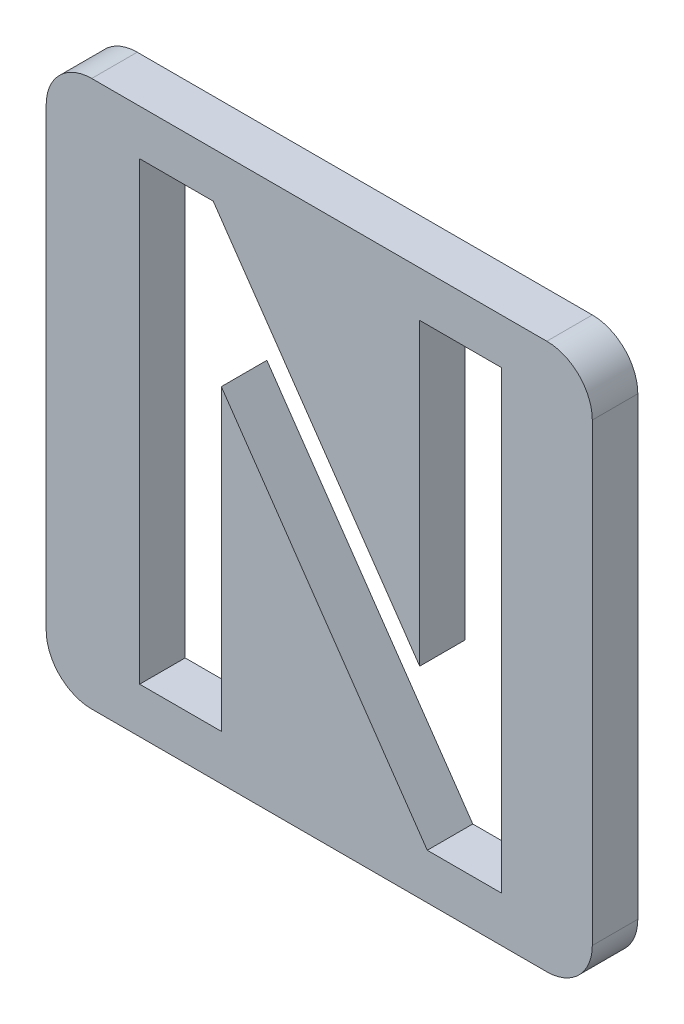
ISO-10303-21;
HEADER;
FILE_DESCRIPTION(('STEP AP214'),'2;1');
FILE_NAME('part.step','',(''),(''),'','','');
FILE_SCHEMA(('AUTOMOTIVE_DESIGN { 1 0 10303 214 1 1 1 1 }'));
ENDSEC;
DATA;
#1=APPLICATION_CONTEXT('core data for automotive mechanical design processes');
#2=APPLICATION_PROTOCOL_DEFINITION('international standard','automotive_design',2000,#1);
#3=PRODUCT_CONTEXT('',#1,'mechanical');
#4=PRODUCT('Part','Part','',(#3));
#5=PRODUCT_RELATED_PRODUCT_CATEGORY('part','',(#4));
#6=PRODUCT_DEFINITION_FORMATION('','',#4);
#7=PRODUCT_DEFINITION_CONTEXT('part definition',#1,'design');
#8=PRODUCT_DEFINITION('design','',#6,#7);
#9=PRODUCT_DEFINITION_SHAPE('','',#8);
#10=(LENGTH_UNIT() NAMED_UNIT(*) SI_UNIT(.MILLI.,.METRE.));
#11=(NAMED_UNIT(*) PLANE_ANGLE_UNIT() SI_UNIT($,.RADIAN.));
#12=(NAMED_UNIT(*) SI_UNIT($,.STERADIAN.) SOLID_ANGLE_UNIT());
#13=UNCERTAINTY_MEASURE_WITH_UNIT(LENGTH_MEASURE(1.E-05),#10,'distance_accuracy_value','');
#14=(GEOMETRIC_REPRESENTATION_CONTEXT(3) GLOBAL_UNCERTAINTY_ASSIGNED_CONTEXT((#13)) GLOBAL_UNIT_ASSIGNED_CONTEXT((#10,
#11,#12)) REPRESENTATION_CONTEXT('',''));
#15=CARTESIAN_POINT('',(0.,0.,0.));
#16=DIRECTION('',(0.,0.,1.));
#17=DIRECTION('',(1.,0.,0.));
#18=AXIS2_PLACEMENT_3D('',#15,#16,#17);
#19=CARTESIAN_POINT('',(50.,50.,10.));
#20=DIRECTION('',(0.,0.,-1.));
#21=DIRECTION('',(-1.,0.,0.));
#22=AXIS2_PLACEMENT_3D('',#19,#20,#21);
#23=PLANE('',#22);
#24=DIRECTION('',(1.,0.,0.));
#25=VECTOR('',#24,1.);
#26=CARTESIAN_POINT('',(-49.9999999999999,60.,10.));
#27=LINE('',#26,#25);
#28=CARTESIAN_POINT('',(-49.9999999999999,60.,10.));
#29=VERTEX_POINT('',#28);
#30=CARTESIAN_POINT('',(49.9999999999999,60.,10.));
#31=VERTEX_POINT('',#30);
#32=EDGE_CURVE('E239',#29,#31,#27,.T.);
#33=ORIENTED_EDGE('',*,*,#32,.F.);
#34=CARTESIAN_POINT('',(-50.,50.,10.));
#35=DIRECTION('',(0.,0.,1.));
#36=DIRECTION('',(1.,0.,0.));
#37=AXIS2_PLACEMENT_3D('',#34,#35,#36);
#38=CIRCLE('',#37,10.);
#39=CARTESIAN_POINT('',(-60.,49.9999999999999,10.));
#40=VERTEX_POINT('',#39);
#41=EDGE_CURVE('E257',#29,#40,#38,.T.);
#42=ORIENTED_EDGE('',*,*,#41,.T.);
#43=DIRECTION('',(0.,-1.,0.));
#44=VECTOR('',#43,1.);
#45=CARTESIAN_POINT('',(-60.,49.9999999999999,10.));
#46=LINE('',#45,#44);
#47=CARTESIAN_POINT('',(-60.,-49.9999999999999,10.));
#48=VERTEX_POINT('',#47);
#49=EDGE_CURVE('E255',#40,#48,#46,.T.);
#50=ORIENTED_EDGE('',*,*,#49,.T.);
#51=CARTESIAN_POINT('',(-50.,-50.,10.));
#52=DIRECTION('',(0.,0.,1.));
#53=DIRECTION('',(1.,0.,0.));
#54=AXIS2_PLACEMENT_3D('',#51,#52,#53);
#55=CIRCLE('',#54,10.);
#56=CARTESIAN_POINT('',(-49.9999999999999,-60.,10.));
#57=VERTEX_POINT('',#56);
#58=EDGE_CURVE('E253',#48,#57,#55,.T.);
#59=ORIENTED_EDGE('',*,*,#58,.T.);
#60=DIRECTION('',(1.,0.,0.));
#61=VECTOR('',#60,1.);
#62=CARTESIAN_POINT('',(-49.9999999999999,-60.,10.));
#63=LINE('',#62,#61);
#64=CARTESIAN_POINT('',(49.9999999999999,-60.,10.));
#65=VERTEX_POINT('',#64);
#66=EDGE_CURVE('E251',#57,#65,#63,.T.);
#67=ORIENTED_EDGE('',*,*,#66,.T.);
#68=CARTESIAN_POINT('',(50.,-50.,10.));
#69=DIRECTION('',(0.,0.,1.));
#70=DIRECTION('',(1.,0.,0.));
#71=AXIS2_PLACEMENT_3D('',#68,#69,#70);
#72=CIRCLE('',#71,10.);
#73=CARTESIAN_POINT('',(60.,-50.,10.));
#74=VERTEX_POINT('',#73);
#75=EDGE_CURVE('E249',#65,#74,#72,.T.);
#76=ORIENTED_EDGE('',*,*,#75,.T.);
#77=DIRECTION('',(0.,-1.,0.));
#78=VECTOR('',#77,1.);
#79=CARTESIAN_POINT('',(60.,49.9999999999999,10.));
#80=LINE('',#79,#78);
#81=CARTESIAN_POINT('',(60.,49.9999999999999,10.));
#82=VERTEX_POINT('',#81);
#83=EDGE_CURVE('E246',#82,#74,#80,.T.);
#84=ORIENTED_EDGE('',*,*,#83,.F.);
#85=CARTESIAN_POINT('',(50.,50.,10.));
#86=DIRECTION('',(0.,0.,-1.));
#87=DIRECTION('',(-1.,0.,0.));
#88=AXIS2_PLACEMENT_3D('',#85,#86,#87);
#89=CIRCLE('',#88,10.);
#90=EDGE_CURVE('E242',#31,#82,#89,.T.);
#91=ORIENTED_EDGE('',*,*,#90,.F.);
#92=EDGE_LOOP('',(#33,#42,#50,#59,#67,#76,#84,#91));
#93=FACE_BOUND('',#92,.T.);
#94=DIRECTION('',(0.,1.,0.));
#95=VECTOR('',#94,1.);
#96=CARTESIAN_POINT('',(-39.4615384615385,-50.,10.));
#97=LINE('',#96,#95);
#98=CARTESIAN_POINT('',(-39.4615384615385,-50.,10.));
#99=VERTEX_POINT('',#98);
#100=CARTESIAN_POINT('',(-39.4615384615385,50.,10.));
#101=VERTEX_POINT('',#100);
#102=EDGE_CURVE('E50',#99,#101,#97,.T.);
#103=ORIENTED_EDGE('',*,*,#102,.T.);
#104=DIRECTION('',(1.,0.,0.));
#105=VECTOR('',#104,1.);
#106=CARTESIAN_POINT('',(-39.4615384615385,50.,10.));
#107=LINE('',#106,#105);
#108=CARTESIAN_POINT('',(-23.2956730769231,50.,10.));
#109=VERTEX_POINT('',#108);
#110=EDGE_CURVE('E174',#101,#109,#107,.T.);
#111=ORIENTED_EDGE('',*,*,#110,.T.);
#112=DIRECTION('',(0.567645105726481,-0.823273365258936,0.));
#113=VECTOR('',#112,1.);
#114=CARTESIAN_POINT('',(-23.2956730769231,50.,10.));
#115=LINE('',#114,#113);
#116=CARTESIAN_POINT('',(22.0769230769231,-15.8052884615385,10.));
#117=VERTEX_POINT('',#116);
#118=EDGE_CURVE('E201',#109,#117,#115,.T.);
#119=ORIENTED_EDGE('',*,*,#118,.T.);
#120=DIRECTION('',(0.,1.,0.));
#121=VECTOR('',#120,1.);
#122=CARTESIAN_POINT('',(22.0769230769231,-15.8052884615385,10.));
#123=LINE('',#122,#121);
#124=CARTESIAN_POINT('',(22.0769230769231,50.,10.));
#125=VERTEX_POINT('',#124);
#126=EDGE_CURVE('E204',#117,#125,#123,.T.);
#127=ORIENTED_EDGE('',*,*,#126,.T.);
#128=DIRECTION('',(1.,0.,0.));
#129=VECTOR('',#128,1.);
#130=CARTESIAN_POINT('',(22.0769230769231,50.,10.));
#131=LINE('',#130,#129);
#132=CARTESIAN_POINT('',(40.025641025641,50.,10.));
#133=VERTEX_POINT('',#132);
#134=EDGE_CURVE('E207',#125,#133,#131,.T.);
#135=ORIENTED_EDGE('',*,*,#134,.T.);
#136=DIRECTION('',(0.,-1.,0.));
#137=VECTOR('',#136,1.);
#138=CARTESIAN_POINT('',(40.025641025641,50.,10.));
#139=LINE('',#138,#137);
#140=CARTESIAN_POINT('',(40.025641025641,-50.,10.));
#141=VERTEX_POINT('',#140);
#142=EDGE_CURVE('E210',#133,#141,#139,.T.);
#143=ORIENTED_EDGE('',*,*,#142,.T.);
#144=DIRECTION('',(-1.,0.,0.));
#145=VECTOR('',#144,1.);
#146=CARTESIAN_POINT('',(40.025641025641,-50.,10.));
#147=LINE('',#146,#145);
#148=CARTESIAN_POINT('',(23.7395833333333,-50.,10.));
#149=VERTEX_POINT('',#148);
#150=EDGE_CURVE('E213',#141,#149,#147,.T.);
#151=ORIENTED_EDGE('',*,*,#150,.T.);
#152=DIRECTION('',(-0.567797563527585,0.823168225122993,0.));
#153=VECTOR('',#152,1.);
#154=CARTESIAN_POINT('',(23.7395833333333,-50.,10.));
#155=LINE('',#154,#153);
#156=CARTESIAN_POINT('',(-21.5128205128205,15.6049679487179,10.));
#157=VERTEX_POINT('',#156);
#158=EDGE_CURVE('E216',#149,#157,#155,.T.);
#159=ORIENTED_EDGE('',*,*,#158,.T.);
#160=DIRECTION('',(0.,-1.,0.));
#161=VECTOR('',#160,1.);
#162=CARTESIAN_POINT('',(-21.5128205128205,15.6049679487179,10.));
#163=LINE('',#162,#161);
#164=CARTESIAN_POINT('',(-21.5128205128205,-50.,10.));
#165=VERTEX_POINT('',#164);
#166=EDGE_CURVE('E219',#157,#165,#163,.T.);
#167=ORIENTED_EDGE('',*,*,#166,.T.);
#168=DIRECTION('',(-1.,0.,0.));
#169=VECTOR('',#168,1.);
#170=CARTESIAN_POINT('',(-21.5128205128205,-50.,10.));
#171=LINE('',#170,#169);
#172=EDGE_CURVE('E168',#165,#99,#171,.T.);
#173=ORIENTED_EDGE('',*,*,#172,.T.);
#174=EDGE_LOOP('',(#103,#111,#119,#127,#135,#143,#151,#159,#167,#173));
#175=FACE_BOUND('',#174,.T.);
#176=ADVANCED_FACE('F33',(#93,#175),#23,.F.);
#177=CARTESIAN_POINT('',(50.,50.,0.));
#178=DIRECTION('',(0.,0.,-1.));
#179=DIRECTION('',(-1.,0.,0.));
#180=AXIS2_PLACEMENT_3D('',#177,#178,#179);
#181=PLANE('',#180);
#182=DIRECTION('',(1.,0.,0.));
#183=VECTOR('',#182,1.);
#184=CARTESIAN_POINT('',(-49.9999999999999,60.,0.));
#185=LINE('',#184,#183);
#186=CARTESIAN_POINT('',(-49.9999999999999,60.,0.));
#187=VERTEX_POINT('',#186);
#188=CARTESIAN_POINT('',(49.9999999999999,60.,0.));
#189=VERTEX_POINT('',#188);
#190=EDGE_CURVE('E175',#187,#189,#185,.T.);
#191=ORIENTED_EDGE('',*,*,#190,.T.);
#192=CARTESIAN_POINT('',(50.,50.,0.));
#193=DIRECTION('',(0.,0.,-1.));
#194=DIRECTION('',(-1.,0.,0.));
#195=AXIS2_PLACEMENT_3D('',#192,#193,#194);
#196=CIRCLE('',#195,10.);
#197=CARTESIAN_POINT('',(60.,49.9999999999999,0.));
#198=VERTEX_POINT('',#197);
#199=EDGE_CURVE('E261',#189,#198,#196,.T.);
#200=ORIENTED_EDGE('',*,*,#199,.T.);
#201=DIRECTION('',(0.,-1.,0.));
#202=VECTOR('',#201,1.);
#203=CARTESIAN_POINT('',(60.,49.9999999999999,0.));
#204=LINE('',#203,#202);
#205=CARTESIAN_POINT('',(60.,-50.,0.));
#206=VERTEX_POINT('',#205);
#207=EDGE_CURVE('E264',#198,#206,#204,.T.);
#208=ORIENTED_EDGE('',*,*,#207,.T.);
#209=CARTESIAN_POINT('',(50.,-50.,0.));
#210=DIRECTION('',(0.,0.,1.));
#211=DIRECTION('',(1.,0.,0.));
#212=AXIS2_PLACEMENT_3D('',#209,#210,#211);
#213=CIRCLE('',#212,10.);
#214=CARTESIAN_POINT('',(49.9999999999999,-60.,0.));
#215=VERTEX_POINT('',#214);
#216=EDGE_CURVE('E267',#215,#206,#213,.T.);
#217=ORIENTED_EDGE('',*,*,#216,.F.);
#218=DIRECTION('',(1.,0.,0.));
#219=VECTOR('',#218,1.);
#220=CARTESIAN_POINT('',(-49.9999999999999,-60.,0.));
#221=LINE('',#220,#219);
#222=CARTESIAN_POINT('',(-49.9999999999999,-60.,0.));
#223=VERTEX_POINT('',#222);
#224=EDGE_CURVE('E270',#223,#215,#221,.T.);
#225=ORIENTED_EDGE('',*,*,#224,.F.);
#226=CARTESIAN_POINT('',(-50.,-50.,0.));
#227=DIRECTION('',(0.,0.,1.));
#228=DIRECTION('',(1.,0.,0.));
#229=AXIS2_PLACEMENT_3D('',#226,#227,#228);
#230=CIRCLE('',#229,10.);
#231=CARTESIAN_POINT('',(-60.,-49.9999999999999,0.));
#232=VERTEX_POINT('',#231);
#233=EDGE_CURVE('E272',#232,#223,#230,.T.);
#234=ORIENTED_EDGE('',*,*,#233,.F.);
#235=DIRECTION('',(0.,-1.,0.));
#236=VECTOR('',#235,1.);
#237=CARTESIAN_POINT('',(-60.,49.9999999999999,0.));
#238=LINE('',#237,#236);
#239=CARTESIAN_POINT('',(-60.,49.9999999999999,0.));
#240=VERTEX_POINT('',#239);
#241=EDGE_CURVE('E274',#240,#232,#238,.T.);
#242=ORIENTED_EDGE('',*,*,#241,.F.);
#243=CARTESIAN_POINT('',(-50.,50.,0.));
#244=DIRECTION('',(0.,0.,1.));
#245=DIRECTION('',(1.,0.,0.));
#246=AXIS2_PLACEMENT_3D('',#243,#244,#245);
#247=CIRCLE('',#246,10.);
#248=EDGE_CURVE('E243',#187,#240,#247,.T.);
#249=ORIENTED_EDGE('',*,*,#248,.F.);
#250=EDGE_LOOP('',(#191,#200,#208,#217,#225,#234,#242,#249));
#251=FACE_BOUND('',#250,.T.);
#252=DIRECTION('',(1.,0.,0.));
#253=VECTOR('',#252,1.);
#254=CARTESIAN_POINT('',(-39.4615384615385,50.,0.));
#255=LINE('',#254,#253);
#256=CARTESIAN_POINT('',(-39.4615384615385,50.,0.));
#257=VERTEX_POINT('',#256);
#258=CARTESIAN_POINT('',(-23.2956730769231,50.,0.));
#259=VERTEX_POINT('',#258);
#260=EDGE_CURVE('E167',#257,#259,#255,.T.);
#261=ORIENTED_EDGE('',*,*,#260,.F.);
#262=DIRECTION('',(0.,1.,0.));
#263=VECTOR('',#262,1.);
#264=CARTESIAN_POINT('',(-39.4615384615385,-50.,0.));
#265=LINE('',#264,#263);
#266=CARTESIAN_POINT('',(-39.4615384615385,-50.,0.));
#267=VERTEX_POINT('',#266);
#268=EDGE_CURVE('E159',#267,#257,#265,.T.);
#269=ORIENTED_EDGE('',*,*,#268,.F.);
#270=DIRECTION('',(-1.,0.,0.));
#271=VECTOR('',#270,1.);
#272=CARTESIAN_POINT('',(-21.5128205128205,-50.,0.));
#273=LINE('',#272,#271);
#274=CARTESIAN_POINT('',(-21.5128205128205,-50.,0.));
#275=VERTEX_POINT('',#274);
#276=EDGE_CURVE('E197',#275,#267,#273,.T.);
#277=ORIENTED_EDGE('',*,*,#276,.F.);
#278=DIRECTION('',(0.,-1.,0.));
#279=VECTOR('',#278,1.);
#280=CARTESIAN_POINT('',(-21.5128205128205,15.6049679487179,0.));
#281=LINE('',#280,#279);
#282=CARTESIAN_POINT('',(-21.5128205128205,15.6049679487179,0.));
#283=VERTEX_POINT('',#282);
#284=EDGE_CURVE('E195',#283,#275,#281,.T.);
#285=ORIENTED_EDGE('',*,*,#284,.F.);
#286=DIRECTION('',(-0.567797563527585,0.823168225122993,0.));
#287=VECTOR('',#286,1.);
#288=CARTESIAN_POINT('',(23.7395833333333,-50.,0.));
#289=LINE('',#288,#287);
#290=CARTESIAN_POINT('',(23.7395833333333,-50.,0.));
#291=VERTEX_POINT('',#290);
#292=EDGE_CURVE('E193',#291,#283,#289,.T.);
#293=ORIENTED_EDGE('',*,*,#292,.F.);
#294=DIRECTION('',(-1.,0.,0.));
#295=VECTOR('',#294,1.);
#296=CARTESIAN_POINT('',(40.025641025641,-50.,0.));
#297=LINE('',#296,#295);
#298=CARTESIAN_POINT('',(40.025641025641,-50.,0.));
#299=VERTEX_POINT('',#298);
#300=EDGE_CURVE('E191',#299,#291,#297,.T.);
#301=ORIENTED_EDGE('',*,*,#300,.F.);
#302=DIRECTION('',(0.,-1.,0.));
#303=VECTOR('',#302,1.);
#304=CARTESIAN_POINT('',(40.025641025641,50.,0.));
#305=LINE('',#304,#303);
#306=CARTESIAN_POINT('',(40.025641025641,50.,0.));
#307=VERTEX_POINT('',#306);
#308=EDGE_CURVE('E189',#307,#299,#305,.T.);
#309=ORIENTED_EDGE('',*,*,#308,.F.);
#310=DIRECTION('',(1.,0.,0.));
#311=VECTOR('',#310,1.);
#312=CARTESIAN_POINT('',(22.0769230769231,50.,0.));
#313=LINE('',#312,#311);
#314=CARTESIAN_POINT('',(22.0769230769231,50.,0.));
#315=VERTEX_POINT('',#314);
#316=EDGE_CURVE('E187',#315,#307,#313,.T.);
#317=ORIENTED_EDGE('',*,*,#316,.F.);
#318=DIRECTION('',(0.,1.,0.));
#319=VECTOR('',#318,1.);
#320=CARTESIAN_POINT('',(22.0769230769231,-15.8052884615385,0.));
#321=LINE('',#320,#319);
#322=CARTESIAN_POINT('',(22.0769230769231,-15.8052884615385,0.));
#323=VERTEX_POINT('',#322);
#324=EDGE_CURVE('E183',#323,#315,#321,.T.);
#325=ORIENTED_EDGE('',*,*,#324,.F.);
#326=DIRECTION('',(0.567645105726481,-0.823273365258936,0.));
#327=VECTOR('',#326,1.);
#328=CARTESIAN_POINT('',(-23.2956730769231,50.,0.));
#329=LINE('',#328,#327);
#330=EDGE_CURVE('E181',#259,#323,#329,.T.);
#331=ORIENTED_EDGE('',*,*,#330,.F.);
#332=EDGE_LOOP('',(#261,#269,#277,#285,#293,#301,#309,#317,#325,#331));
#333=FACE_BOUND('',#332,.T.);
#334=ADVANCED_FACE('F179',(#251,#333),#181,.T.);
#335=CARTESIAN_POINT('',(-49.9999999999999,60.,10.));
#336=DIRECTION('',(0.,1.,0.));
#337=DIRECTION('',(0.,0.,1.));
#338=AXIS2_PLACEMENT_3D('',#335,#336,#337);
#339=PLANE('',#338);
#340=ORIENTED_EDGE('',*,*,#190,.F.);
#341=DIRECTION('',(0.,0.,-1.));
#342=VECTOR('',#341,1.);
#343=CARTESIAN_POINT('',(-49.9999999999999,60.,10.));
#344=LINE('',#343,#342);
#345=EDGE_CURVE('E11',#29,#187,#344,.T.);
#346=ORIENTED_EDGE('',*,*,#345,.F.);
#347=ORIENTED_EDGE('',*,*,#32,.T.);
#348=DIRECTION('',(0.,0.,-1.));
#349=VECTOR('',#348,1.);
#350=CARTESIAN_POINT('',(49.9999999999999,60.,10.));
#351=LINE('',#350,#349);
#352=EDGE_CURVE('E37',#31,#189,#351,.T.);
#353=ORIENTED_EDGE('',*,*,#352,.T.);
#354=EDGE_LOOP('',(#340,#346,#347,#353));
#355=FACE_BOUND('',#354,.T.);
#356=ADVANCED_FACE('F35',(#355),#339,.T.);
#357=CARTESIAN_POINT('',(-50.,50.,10.));
#358=DIRECTION('',(0.,0.,-1.));
#359=DIRECTION('',(-1.,0.,0.));
#360=AXIS2_PLACEMENT_3D('',#357,#358,#359);
#361=CYLINDRICAL_SURFACE('',#360,10.);
#362=ORIENTED_EDGE('',*,*,#248,.T.);
#363=DIRECTION('',(0.,0.,-1.));
#364=VECTOR('',#363,1.);
#365=CARTESIAN_POINT('',(-60.,49.9999999999999,10.));
#366=LINE('',#365,#364);
#367=EDGE_CURVE('E42',#40,#240,#366,.T.);
#368=ORIENTED_EDGE('',*,*,#367,.F.);
#369=ORIENTED_EDGE('',*,*,#41,.F.);
#370=ORIENTED_EDGE('',*,*,#345,.T.);
#371=EDGE_LOOP('',(#362,#368,#369,#370));
#372=FACE_BOUND('',#371,.T.);
#373=ADVANCED_FACE('F304',(#372),#361,.T.);
#374=CARTESIAN_POINT('',(-60.,49.9999999999999,10.));
#375=DIRECTION('',(1.,0.,0.));
#376=DIRECTION('',(0.,1.,0.));
#377=AXIS2_PLACEMENT_3D('',#374,#375,#376);
#378=PLANE('',#377);
#379=ORIENTED_EDGE('',*,*,#241,.T.);
#380=DIRECTION('',(0.,0.,-1.));
#381=VECTOR('',#380,1.);
#382=CARTESIAN_POINT('',(-60.,-49.9999999999999,10.));
#383=LINE('',#382,#381);
#384=EDGE_CURVE('E279',#48,#232,#383,.T.);
#385=ORIENTED_EDGE('',*,*,#384,.F.);
#386=ORIENTED_EDGE('',*,*,#49,.F.);
#387=ORIENTED_EDGE('',*,*,#367,.T.);
#388=EDGE_LOOP('',(#379,#385,#386,#387));
#389=FACE_BOUND('',#388,.T.);
#390=ADVANCED_FACE('F308',(#389),#378,.F.);
#391=CARTESIAN_POINT('',(-50.,-50.,10.));
#392=DIRECTION('',(0.,0.,-1.));
#393=DIRECTION('',(-1.,0.,0.));
#394=AXIS2_PLACEMENT_3D('',#391,#392,#393);
#395=CYLINDRICAL_SURFACE('',#394,10.);
#396=ORIENTED_EDGE('',*,*,#233,.T.);
#397=DIRECTION('',(0.,0.,-1.));
#398=VECTOR('',#397,1.);
#399=CARTESIAN_POINT('',(-49.9999999999999,-60.,10.));
#400=LINE('',#399,#398);
#401=EDGE_CURVE('E282',#57,#223,#400,.T.);
#402=ORIENTED_EDGE('',*,*,#401,.F.);
#403=ORIENTED_EDGE('',*,*,#58,.F.);
#404=ORIENTED_EDGE('',*,*,#384,.T.);
#405=EDGE_LOOP('',(#396,#402,#403,#404));
#406=FACE_BOUND('',#405,.T.);
#407=ADVANCED_FACE('F328',(#406),#395,.T.);
#408=CARTESIAN_POINT('',(-49.9999999999999,-60.,10.));
#409=DIRECTION('',(0.,1.,0.));
#410=DIRECTION('',(0.,0.,1.));
#411=AXIS2_PLACEMENT_3D('',#408,#409,#410);
#412=PLANE('',#411);
#413=ORIENTED_EDGE('',*,*,#224,.T.);
#414=DIRECTION('',(0.,0.,-1.));
#415=VECTOR('',#414,1.);
#416=CARTESIAN_POINT('',(49.9999999999999,-60.,10.));
#417=LINE('',#416,#415);
#418=EDGE_CURVE('E285',#65,#215,#417,.T.);
#419=ORIENTED_EDGE('',*,*,#418,.F.);
#420=ORIENTED_EDGE('',*,*,#66,.F.);
#421=ORIENTED_EDGE('',*,*,#401,.T.);
#422=EDGE_LOOP('',(#413,#419,#420,#421));
#423=FACE_BOUND('',#422,.T.);
#424=ADVANCED_FACE('F326',(#423),#412,.F.);
#425=CARTESIAN_POINT('',(50.,-50.,10.));
#426=DIRECTION('',(0.,0.,-1.));
#427=DIRECTION('',(-1.,0.,0.));
#428=AXIS2_PLACEMENT_3D('',#425,#426,#427);
#429=CYLINDRICAL_SURFACE('',#428,10.);
#430=ORIENTED_EDGE('',*,*,#216,.T.);
#431=DIRECTION('',(0.,0.,-1.));
#432=VECTOR('',#431,1.);
#433=CARTESIAN_POINT('',(60.,-50.,10.));
#434=LINE('',#433,#432);
#435=EDGE_CURVE('E288',#74,#206,#434,.T.);
#436=ORIENTED_EDGE('',*,*,#435,.F.);
#437=ORIENTED_EDGE('',*,*,#75,.F.);
#438=ORIENTED_EDGE('',*,*,#418,.T.);
#439=EDGE_LOOP('',(#430,#436,#437,#438));
#440=FACE_BOUND('',#439,.T.);
#441=ADVANCED_FACE('F322',(#440),#429,.T.);
#442=CARTESIAN_POINT('',(60.,49.9999999999999,10.));
#443=DIRECTION('',(1.,0.,0.));
#444=DIRECTION('',(0.,1.,0.));
#445=AXIS2_PLACEMENT_3D('',#442,#443,#444);
#446=PLANE('',#445);
#447=ORIENTED_EDGE('',*,*,#207,.F.);
#448=DIRECTION('',(0.,0.,-1.));
#449=VECTOR('',#448,1.);
#450=CARTESIAN_POINT('',(60.,49.9999999999999,10.));
#451=LINE('',#450,#449);
#452=EDGE_CURVE('E289',#82,#198,#451,.T.);
#453=ORIENTED_EDGE('',*,*,#452,.F.);
#454=ORIENTED_EDGE('',*,*,#83,.T.);
#455=ORIENTED_EDGE('',*,*,#435,.T.);
#456=EDGE_LOOP('',(#447,#453,#454,#455));
#457=FACE_BOUND('',#456,.T.);
#458=ADVANCED_FACE('F318',(#457),#446,.T.);
#459=CARTESIAN_POINT('',(50.,50.,10.));
#460=DIRECTION('',(0.,0.,-1.));
#461=DIRECTION('',(-1.,0.,0.));
#462=AXIS2_PLACEMENT_3D('',#459,#460,#461);
#463=CYLINDRICAL_SURFACE('',#462,10.);
#464=ORIENTED_EDGE('',*,*,#199,.F.);
#465=ORIENTED_EDGE('',*,*,#352,.F.);
#466=ORIENTED_EDGE('',*,*,#90,.T.);
#467=ORIENTED_EDGE('',*,*,#452,.T.);
#468=EDGE_LOOP('',(#464,#465,#466,#467));
#469=FACE_BOUND('',#468,.T.);
#470=ADVANCED_FACE('F297',(#469),#463,.T.);
#471=CARTESIAN_POINT('',(-39.4615384615385,-50.,0.));
#472=DIRECTION('',(1.,0.,0.));
#473=DIRECTION('',(0.,0.,-1.));
#474=AXIS2_PLACEMENT_3D('',#471,#472,#473);
#475=PLANE('',#474);
#476=ORIENTED_EDGE('',*,*,#102,.F.);
#477=DIRECTION('',(0.,0.,1.));
#478=VECTOR('',#477,1.);
#479=CARTESIAN_POINT('',(-39.4615384615385,-50.,0.));
#480=LINE('',#479,#478);
#481=EDGE_CURVE('E163',#267,#99,#480,.T.);
#482=ORIENTED_EDGE('',*,*,#481,.F.);
#483=ORIENTED_EDGE('',*,*,#268,.T.);
#484=DIRECTION('',(0.,0.,1.));
#485=VECTOR('',#484,1.);
#486=CARTESIAN_POINT('',(-39.4615384615385,50.,0.));
#487=LINE('',#486,#485);
#488=EDGE_CURVE('E162',#257,#101,#487,.T.);
#489=ORIENTED_EDGE('',*,*,#488,.T.);
#490=EDGE_LOOP('',(#476,#482,#483,#489));
#491=FACE_BOUND('',#490,.T.);
#492=ADVANCED_FACE('F161',(#491),#475,.T.);
#493=CARTESIAN_POINT('',(-39.4615384615385,50.,0.));
#494=DIRECTION('',(0.,-1.,0.));
#495=DIRECTION('',(0.,0.,-1.));
#496=AXIS2_PLACEMENT_3D('',#493,#494,#495);
#497=PLANE('',#496);
#498=ORIENTED_EDGE('',*,*,#110,.F.);
#499=ORIENTED_EDGE('',*,*,#488,.F.);
#500=ORIENTED_EDGE('',*,*,#260,.T.);
#501=DIRECTION('',(0.,0.,1.));
#502=VECTOR('',#501,1.);
#503=CARTESIAN_POINT('',(-23.2956730769231,50.,0.));
#504=LINE('',#503,#502);
#505=EDGE_CURVE('E176',#259,#109,#504,.T.);
#506=ORIENTED_EDGE('',*,*,#505,.T.);
#507=EDGE_LOOP('',(#498,#499,#500,#506));
#508=FACE_BOUND('',#507,.T.);
#509=ADVANCED_FACE('F171',(#508),#497,.T.);
#510=CARTESIAN_POINT('',(-23.2956730769231,50.,0.));
#511=DIRECTION('',(-0.823273365258936,-0.567645105726481,0.));
#512=DIRECTION('',(0.567645105726481,-0.823273365258936,0.));
#513=AXIS2_PLACEMENT_3D('',#510,#511,#512);
#514=PLANE('',#513);
#515=ORIENTED_EDGE('',*,*,#118,.F.);
#516=ORIENTED_EDGE('',*,*,#505,.F.);
#517=ORIENTED_EDGE('',*,*,#330,.T.);
#518=DIRECTION('',(0.,0.,1.));
#519=VECTOR('',#518,1.);
#520=CARTESIAN_POINT('',(22.0769230769231,-15.8052884615385,0.));
#521=LINE('',#520,#519);
#522=EDGE_CURVE('E236',#323,#117,#521,.T.);
#523=ORIENTED_EDGE('',*,*,#522,.T.);
#524=EDGE_LOOP('',(#515,#516,#517,#523));
#525=FACE_BOUND('',#524,.T.);
#526=ADVANCED_FACE('F377',(#525),#514,.T.);
#527=CARTESIAN_POINT('',(22.0769230769231,-15.8052884615385,0.));
#528=DIRECTION('',(1.,0.,0.));
#529=DIRECTION('',(0.,0.,-1.));
#530=AXIS2_PLACEMENT_3D('',#527,#528,#529);
#531=PLANE('',#530);
#532=ORIENTED_EDGE('',*,*,#126,.F.);
#533=ORIENTED_EDGE('',*,*,#522,.F.);
#534=ORIENTED_EDGE('',*,*,#324,.T.);
#535=DIRECTION('',(0.,0.,1.));
#536=VECTOR('',#535,1.);
#537=CARTESIAN_POINT('',(22.0769230769231,50.,0.));
#538=LINE('',#537,#536);
#539=EDGE_CURVE('E234',#315,#125,#538,.T.);
#540=ORIENTED_EDGE('',*,*,#539,.T.);
#541=EDGE_LOOP('',(#532,#533,#534,#540));
#542=FACE_BOUND('',#541,.T.);
#543=ADVANCED_FACE('F385',(#542),#531,.T.);
#544=CARTESIAN_POINT('',(22.0769230769231,50.,0.));
#545=DIRECTION('',(0.,-1.,0.));
#546=DIRECTION('',(0.,0.,-1.));
#547=AXIS2_PLACEMENT_3D('',#544,#545,#546);
#548=PLANE('',#547);
#549=ORIENTED_EDGE('',*,*,#134,.F.);
#550=ORIENTED_EDGE('',*,*,#539,.F.);
#551=ORIENTED_EDGE('',*,*,#316,.T.);
#552=DIRECTION('',(0.,0.,1.));
#553=VECTOR('',#552,1.);
#554=CARTESIAN_POINT('',(40.025641025641,50.,0.));
#555=LINE('',#554,#553);
#556=EDGE_CURVE('E232',#307,#133,#555,.T.);
#557=ORIENTED_EDGE('',*,*,#556,.T.);
#558=EDGE_LOOP('',(#549,#550,#551,#557));
#559=FACE_BOUND('',#558,.T.);
#560=ADVANCED_FACE('F395',(#559),#548,.T.);
#561=CARTESIAN_POINT('',(40.025641025641,50.,0.));
#562=DIRECTION('',(-1.,0.,0.));
#563=DIRECTION('',(0.,0.,1.));
#564=AXIS2_PLACEMENT_3D('',#561,#562,#563);
#565=PLANE('',#564);
#566=ORIENTED_EDGE('',*,*,#142,.F.);
#567=ORIENTED_EDGE('',*,*,#556,.F.);
#568=ORIENTED_EDGE('',*,*,#308,.T.);
#569=DIRECTION('',(0.,0.,1.));
#570=VECTOR('',#569,1.);
#571=CARTESIAN_POINT('',(40.025641025641,-50.,0.));
#572=LINE('',#571,#570);
#573=EDGE_CURVE('E230',#299,#141,#572,.T.);
#574=ORIENTED_EDGE('',*,*,#573,.T.);
#575=EDGE_LOOP('',(#566,#567,#568,#574));
#576=FACE_BOUND('',#575,.T.);
#577=ADVANCED_FACE('F405',(#576),#565,.T.);
#578=CARTESIAN_POINT('',(40.025641025641,-50.,0.));
#579=DIRECTION('',(0.,1.,0.));
#580=DIRECTION('',(0.,0.,1.));
#581=AXIS2_PLACEMENT_3D('',#578,#579,#580);
#582=PLANE('',#581);
#583=ORIENTED_EDGE('',*,*,#150,.F.);
#584=ORIENTED_EDGE('',*,*,#573,.F.);
#585=ORIENTED_EDGE('',*,*,#300,.T.);
#586=DIRECTION('',(0.,0.,1.));
#587=VECTOR('',#586,1.);
#588=CARTESIAN_POINT('',(23.7395833333333,-50.,0.));
#589=LINE('',#588,#587);
#590=EDGE_CURVE('E228',#291,#149,#589,.T.);
#591=ORIENTED_EDGE('',*,*,#590,.T.);
#592=EDGE_LOOP('',(#583,#584,#585,#591));
#593=FACE_BOUND('',#592,.T.);
#594=ADVANCED_FACE('F415',(#593),#582,.T.);
#595=CARTESIAN_POINT('',(23.7395833333333,-50.,0.));
#596=DIRECTION('',(0.823168225122993,0.567797563527585,0.));
#597=DIRECTION('',(-0.567797563527585,0.823168225122993,0.));
#598=AXIS2_PLACEMENT_3D('',#595,#596,#597);
#599=PLANE('',#598);
#600=ORIENTED_EDGE('',*,*,#158,.F.);
#601=ORIENTED_EDGE('',*,*,#590,.F.);
#602=ORIENTED_EDGE('',*,*,#292,.T.);
#603=DIRECTION('',(0.,0.,1.));
#604=VECTOR('',#603,1.);
#605=CARTESIAN_POINT('',(-21.5128205128205,15.6049679487179,0.));
#606=LINE('',#605,#604);
#607=EDGE_CURVE('E226',#283,#157,#606,.T.);
#608=ORIENTED_EDGE('',*,*,#607,.T.);
#609=EDGE_LOOP('',(#600,#601,#602,#608));
#610=FACE_BOUND('',#609,.T.);
#611=ADVANCED_FACE('F425',(#610),#599,.T.);
#612=CARTESIAN_POINT('',(-21.5128205128205,15.6049679487179,0.));
#613=DIRECTION('',(-1.,0.,0.));
#614=DIRECTION('',(0.,0.,1.));
#615=AXIS2_PLACEMENT_3D('',#612,#613,#614);
#616=PLANE('',#615);
#617=ORIENTED_EDGE('',*,*,#166,.F.);
#618=ORIENTED_EDGE('',*,*,#607,.F.);
#619=ORIENTED_EDGE('',*,*,#284,.T.);
#620=DIRECTION('',(0.,0.,1.));
#621=VECTOR('',#620,1.);
#622=CARTESIAN_POINT('',(-21.5128205128205,-50.,0.));
#623=LINE('',#622,#621);
#624=EDGE_CURVE('E58',#275,#165,#623,.T.);
#625=ORIENTED_EDGE('',*,*,#624,.T.);
#626=EDGE_LOOP('',(#617,#618,#619,#625));
#627=FACE_BOUND('',#626,.T.);
#628=ADVANCED_FACE('F435',(#627),#616,.T.);
#629=CARTESIAN_POINT('',(-21.5128205128205,-50.,0.));
#630=DIRECTION('',(0.,1.,0.));
#631=DIRECTION('',(0.,0.,1.));
#632=AXIS2_PLACEMENT_3D('',#629,#630,#631);
#633=PLANE('',#632);
#634=ORIENTED_EDGE('',*,*,#172,.F.);
#635=ORIENTED_EDGE('',*,*,#624,.F.);
#636=ORIENTED_EDGE('',*,*,#276,.T.);
#637=ORIENTED_EDGE('',*,*,#481,.T.);
#638=EDGE_LOOP('',(#634,#635,#636,#637));
#639=FACE_BOUND('',#638,.T.);
#640=ADVANCED_FACE('F445',(#639),#633,.T.);
#641=CLOSED_SHELL('',(#176,#334,#356,#373,#390,#407,#424,#441,#458,#470,#492,#509,#526,#543,
#560,#577,#594,#611,#628,#640));
#642=MANIFOLD_SOLID_BREP('B2',#641);
#643=ADVANCED_BREP_SHAPE_REPRESENTATION('',(#18,#642),#14);
#644=SHAPE_DEFINITION_REPRESENTATION(#9,#643);
ENDSEC;
END-ISO-10303-21;
